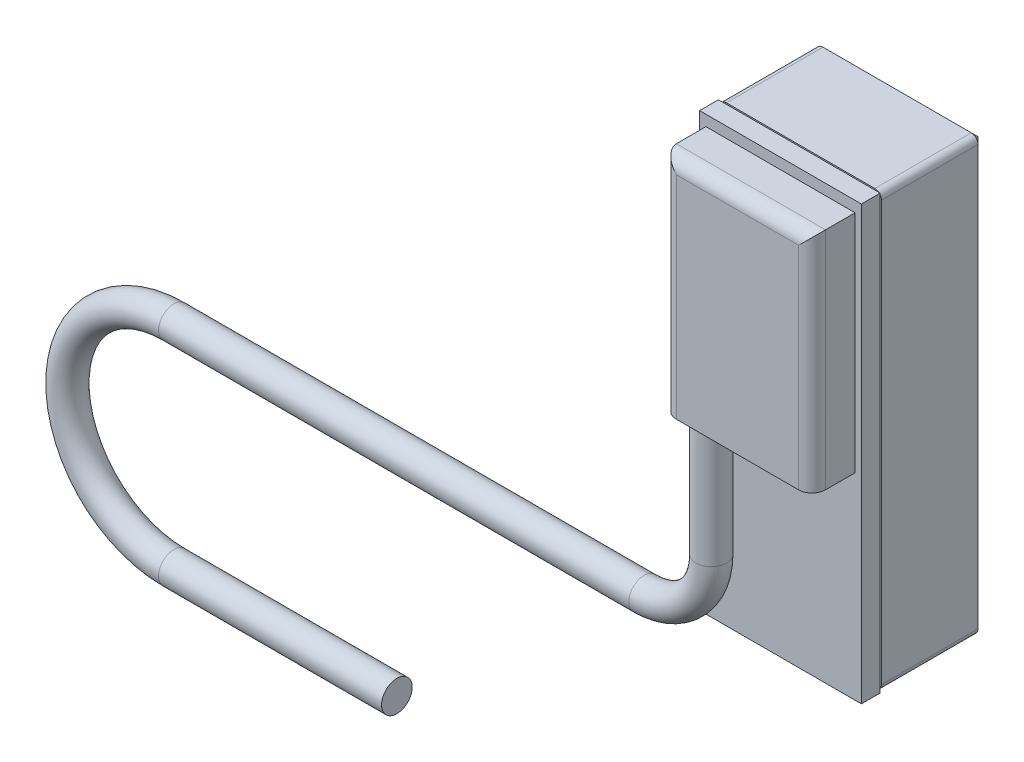
ISO-10303-21;
HEADER;
FILE_DESCRIPTION(('STEP AP214'),'2;1');
FILE_NAME('part.step','',(''),(''),'','','');
FILE_SCHEMA(('AUTOMOTIVE_DESIGN { 1 0 10303 214 1 1 1 1 }'));
ENDSEC;
DATA;
#1=APPLICATION_CONTEXT('core data for automotive mechanical design processes');
#2=APPLICATION_PROTOCOL_DEFINITION('international standard','automotive_design',2000,#1);
#3=PRODUCT_CONTEXT('',#1,'mechanical');
#4=PRODUCT('Part','Part','',(#3));
#5=PRODUCT_RELATED_PRODUCT_CATEGORY('part','',(#4));
#6=PRODUCT_DEFINITION_FORMATION('','',#4);
#7=PRODUCT_DEFINITION_CONTEXT('part definition',#1,'design');
#8=PRODUCT_DEFINITION('design','',#6,#7);
#9=PRODUCT_DEFINITION_SHAPE('','',#8);
#10=(LENGTH_UNIT() NAMED_UNIT(*) SI_UNIT(.MILLI.,.METRE.));
#11=(NAMED_UNIT(*) PLANE_ANGLE_UNIT() SI_UNIT($,.RADIAN.));
#12=(NAMED_UNIT(*) SI_UNIT($,.STERADIAN.) SOLID_ANGLE_UNIT());
#13=UNCERTAINTY_MEASURE_WITH_UNIT(LENGTH_MEASURE(1.E-05),#10,'distance_accuracy_value','');
#14=(GEOMETRIC_REPRESENTATION_CONTEXT(3) GLOBAL_UNCERTAINTY_ASSIGNED_CONTEXT((#13)) GLOBAL_UNIT_ASSIGNED_CONTEXT((#10,
#11,#12)) REPRESENTATION_CONTEXT('',''));
#15=CARTESIAN_POINT('',(0.,0.,0.));
#16=DIRECTION('',(0.,0.,1.));
#17=DIRECTION('',(1.,0.,0.));
#18=AXIS2_PLACEMENT_3D('',#15,#16,#17);
#19=CARTESIAN_POINT('',(0.,0.,4.59));
#20=DIRECTION('',(0.,0.,-1.));
#21=DIRECTION('',(-1.,0.,0.));
#22=AXIS2_PLACEMENT_3D('',#19,#20,#21);
#23=PLANE('',#22);
#24=DIRECTION('',(0.,1.,0.));
#25=VECTOR('',#24,1.);
#26=CARTESIAN_POINT('',(3.01,-8.055,4.59));
#27=LINE('',#26,#25);
#28=CARTESIAN_POINT('',(3.01,-8.055,4.59));
#29=VERTEX_POINT('',#28);
#30=CARTESIAN_POINT('',(3.01,8.055,4.59));
#31=VERTEX_POINT('',#30);
#32=EDGE_CURVE('E162',#29,#31,#27,.T.);
#33=ORIENTED_EDGE('',*,*,#32,.T.);
#34=DIRECTION('',(-1.,0.,0.));
#35=VECTOR('',#34,1.);
#36=CARTESIAN_POINT('',(-3.01,8.055,4.59));
#37=LINE('',#36,#35);
#38=CARTESIAN_POINT('',(-3.01,8.055,4.59));
#39=VERTEX_POINT('',#38);
#40=EDGE_CURVE('E165',#31,#39,#37,.T.);
#41=ORIENTED_EDGE('',*,*,#40,.T.);
#42=DIRECTION('',(0.,-1.,0.));
#43=VECTOR('',#42,1.);
#44=CARTESIAN_POINT('',(-3.01,-8.055,4.59));
#45=LINE('',#44,#43);
#46=CARTESIAN_POINT('',(-3.01,-8.055,4.59));
#47=VERTEX_POINT('',#46);
#48=EDGE_CURVE('E168',#39,#47,#45,.T.);
#49=ORIENTED_EDGE('',*,*,#48,.T.);
#50=DIRECTION('',(1.,0.,0.));
#51=VECTOR('',#50,1.);
#52=CARTESIAN_POINT('',(-3.01,-8.055,4.59));
#53=LINE('',#52,#51);
#54=EDGE_CURVE('E170',#47,#29,#53,.T.);
#55=ORIENTED_EDGE('',*,*,#54,.T.);
#56=EDGE_LOOP('',(#33,#41,#49,#55));
#57=FACE_BOUND('',#56,.T.);
#58=DIRECTION('',(0.,1.,0.));
#59=VECTOR('',#58,1.);
#60=CARTESIAN_POINT('',(2.775,-0.725000000000003,4.59));
#61=LINE('',#60,#59);
#62=CARTESIAN_POINT('',(2.775,-0.725000000000003,4.59));
#63=VERTEX_POINT('',#62);
#64=CARTESIAN_POINT('',(2.775,7.655,4.59));
#65=VERTEX_POINT('',#64);
#66=EDGE_CURVE('E143',#63,#65,#61,.T.);
#67=ORIENTED_EDGE('',*,*,#66,.F.);
#68=DIRECTION('',(1.,0.,0.));
#69=VECTOR('',#68,1.);
#70=CARTESIAN_POINT('',(-2.775,-0.725000000000003,4.59));
#71=LINE('',#70,#69);
#72=CARTESIAN_POINT('',(-2.775,-0.725000000000003,4.59));
#73=VERTEX_POINT('',#72);
#74=EDGE_CURVE('E142',#73,#63,#71,.T.);
#75=ORIENTED_EDGE('',*,*,#74,.F.);
#76=DIRECTION('',(0.,-1.,0.));
#77=VECTOR('',#76,1.);
#78=CARTESIAN_POINT('',(-2.775,-0.725000000000003,4.59));
#79=LINE('',#78,#77);
#80=CARTESIAN_POINT('',(-2.775,7.655,4.59));
#81=VERTEX_POINT('',#80);
#82=EDGE_CURVE('E149',#81,#73,#79,.T.);
#83=ORIENTED_EDGE('',*,*,#82,.F.);
#84=DIRECTION('',(-1.,0.,0.));
#85=VECTOR('',#84,1.);
#86=CARTESIAN_POINT('',(-2.775,7.655,4.59));
#87=LINE('',#86,#85);
#88=EDGE_CURVE('E146',#65,#81,#87,.T.);
#89=ORIENTED_EDGE('',*,*,#88,.F.);
#90=EDGE_LOOP('',(#67,#75,#83,#89));
#91=FACE_BOUND('',#90,.T.);
#92=ADVANCED_FACE('F46',(#57,#91),#23,.F.);
#93=CARTESIAN_POINT('',(3.01,-8.055,4.59));
#94=DIRECTION('',(-1.,0.,0.));
#95=DIRECTION('',(0.,0.,1.));
#96=AXIS2_PLACEMENT_3D('',#93,#94,#95);
#97=PLANE('',#96);
#98=DIRECTION('',(0.,1.,0.));
#99=VECTOR('',#98,1.);
#100=CARTESIAN_POINT('',(3.01,-8.055,3.89));
#101=LINE('',#100,#99);
#102=CARTESIAN_POINT('',(3.01,-8.055,3.89));
#103=VERTEX_POINT('',#102);
#104=CARTESIAN_POINT('',(3.01,8.055,3.89));
#105=VERTEX_POINT('',#104);
#106=EDGE_CURVE('E161',#103,#105,#101,.T.);
#107=ORIENTED_EDGE('',*,*,#106,.T.);
#108=DIRECTION('',(0.,0.,-1.));
#109=VECTOR('',#108,1.);
#110=CARTESIAN_POINT('',(3.01,8.055,4.59));
#111=LINE('',#110,#109);
#112=EDGE_CURVE('E188',#31,#105,#111,.T.);
#113=ORIENTED_EDGE('',*,*,#112,.F.);
#114=ORIENTED_EDGE('',*,*,#32,.F.);
#115=DIRECTION('',(0.,0.,-1.));
#116=VECTOR('',#115,1.);
#117=CARTESIAN_POINT('',(3.01,-8.055,4.59));
#118=LINE('',#117,#116);
#119=EDGE_CURVE('E172',#29,#103,#118,.T.);
#120=ORIENTED_EDGE('',*,*,#119,.T.);
#121=EDGE_LOOP('',(#107,#113,#114,#120));
#122=FACE_BOUND('',#121,.T.);
#123=ADVANCED_FACE('F239',(#122),#97,.F.);
#124=CARTESIAN_POINT('',(-3.01,8.055,4.59));
#125=DIRECTION('',(0.,-1.,0.));
#126=DIRECTION('',(0.,0.,-1.));
#127=AXIS2_PLACEMENT_3D('',#124,#125,#126);
#128=PLANE('',#127);
#129=DIRECTION('',(-1.,0.,0.));
#130=VECTOR('',#129,1.);
#131=CARTESIAN_POINT('',(-3.01,8.055,3.89));
#132=LINE('',#131,#130);
#133=CARTESIAN_POINT('',(-3.01,8.055,3.89));
#134=VERTEX_POINT('',#133);
#135=EDGE_CURVE('E175',#105,#134,#132,.T.);
#136=ORIENTED_EDGE('',*,*,#135,.T.);
#137=DIRECTION('',(0.,0.,-1.));
#138=VECTOR('',#137,1.);
#139=CARTESIAN_POINT('',(-3.01,8.055,4.59));
#140=LINE('',#139,#138);
#141=EDGE_CURVE('E185',#39,#134,#140,.T.);
#142=ORIENTED_EDGE('',*,*,#141,.F.);
#143=ORIENTED_EDGE('',*,*,#40,.F.);
#144=ORIENTED_EDGE('',*,*,#112,.T.);
#145=EDGE_LOOP('',(#136,#142,#143,#144));
#146=FACE_BOUND('',#145,.T.);
#147=ADVANCED_FACE('F245',(#146),#128,.F.);
#148=CARTESIAN_POINT('',(-3.01,-8.055,4.59));
#149=DIRECTION('',(1.,0.,0.));
#150=DIRECTION('',(0.,0.,-1.));
#151=AXIS2_PLACEMENT_3D('',#148,#149,#150);
#152=PLANE('',#151);
#153=DIRECTION('',(0.,-1.,0.));
#154=VECTOR('',#153,1.);
#155=CARTESIAN_POINT('',(-3.01,-8.055,3.89));
#156=LINE('',#155,#154);
#157=CARTESIAN_POINT('',(-3.01,-8.055,3.89));
#158=VERTEX_POINT('',#157);
#159=EDGE_CURVE('E177',#134,#158,#156,.T.);
#160=ORIENTED_EDGE('',*,*,#159,.T.);
#161=DIRECTION('',(0.,0.,-1.));
#162=VECTOR('',#161,1.);
#163=CARTESIAN_POINT('',(-3.01,-8.055,4.59));
#164=LINE('',#163,#162);
#165=EDGE_CURVE('E182',#47,#158,#164,.T.);
#166=ORIENTED_EDGE('',*,*,#165,.F.);
#167=ORIENTED_EDGE('',*,*,#48,.F.);
#168=ORIENTED_EDGE('',*,*,#141,.T.);
#169=EDGE_LOOP('',(#160,#166,#167,#168));
#170=FACE_BOUND('',#169,.T.);
#171=ADVANCED_FACE('F255',(#170),#152,.F.);
#172=CARTESIAN_POINT('',(-3.01,-8.055,4.59));
#173=DIRECTION('',(0.,1.,0.));
#174=DIRECTION('',(0.,0.,1.));
#175=AXIS2_PLACEMENT_3D('',#172,#173,#174);
#176=PLANE('',#175);
#177=DIRECTION('',(1.,0.,0.));
#178=VECTOR('',#177,1.);
#179=CARTESIAN_POINT('',(-3.01,-8.055,3.89));
#180=LINE('',#179,#178);
#181=EDGE_CURVE('E166',#158,#103,#180,.T.);
#182=ORIENTED_EDGE('',*,*,#181,.T.);
#183=ORIENTED_EDGE('',*,*,#119,.F.);
#184=ORIENTED_EDGE('',*,*,#54,.F.);
#185=ORIENTED_EDGE('',*,*,#165,.T.);
#186=EDGE_LOOP('',(#182,#183,#184,#185));
#187=FACE_BOUND('',#186,.T.);
#188=ADVANCED_FACE('F251',(#187),#176,.F.);
#189=CARTESIAN_POINT('',(0.,0.,3.89));
#190=DIRECTION('',(0.,0.,-1.));
#191=DIRECTION('',(-1.,0.,0.));
#192=AXIS2_PLACEMENT_3D('',#189,#190,#191);
#193=PLANE('',#192);
#194=ORIENTED_EDGE('',*,*,#106,.F.);
#195=ORIENTED_EDGE('',*,*,#181,.F.);
#196=ORIENTED_EDGE('',*,*,#159,.F.);
#197=ORIENTED_EDGE('',*,*,#135,.F.);
#198=EDGE_LOOP('',(#194,#195,#196,#197));
#199=FACE_BOUND('',#198,.T.);
#200=ADVANCED_FACE('F236',(#199),#193,.T.);
#201=CARTESIAN_POINT('',(2.775,-0.725000000000003,6.19));
#202=DIRECTION('',(-1.,0.,0.));
#203=DIRECTION('',(0.,0.,1.));
#204=AXIS2_PLACEMENT_3D('',#201,#202,#203);
#205=PLANE('',#204);
#206=DIRECTION('',(0.,0.,-1.));
#207=VECTOR('',#206,1.);
#208=CARTESIAN_POINT('',(2.775,7.655,6.19));
#209=LINE('',#208,#207);
#210=CARTESIAN_POINT('',(2.775,7.655,5.69));
#211=VERTEX_POINT('',#210);
#212=EDGE_CURVE('E159',#211,#65,#209,.T.);
#213=ORIENTED_EDGE('',*,*,#212,.F.);
#214=DIRECTION('',(0.,1.,0.));
#215=VECTOR('',#214,1.);
#216=CARTESIAN_POINT('',(2.775,-0.725000000000003,5.69));
#217=LINE('',#216,#215);
#218=CARTESIAN_POINT('',(2.775,-0.725000000000003,5.69));
#219=VERTEX_POINT('',#218);
#220=EDGE_CURVE('E12',#211,#219,#217,.F.);
#221=ORIENTED_EDGE('',*,*,#220,.T.);
#222=DIRECTION('',(0.,0.,-1.));
#223=VECTOR('',#222,1.);
#224=CARTESIAN_POINT('',(2.775,-0.725000000000003,6.19));
#225=LINE('',#224,#223);
#226=EDGE_CURVE('E141',#219,#63,#225,.T.);
#227=ORIENTED_EDGE('',*,*,#226,.T.);
#228=ORIENTED_EDGE('',*,*,#66,.T.);
#229=EDGE_LOOP('',(#213,#221,#227,#228));
#230=FACE_BOUND('',#229,.T.);
#231=ADVANCED_FACE('F224',(#230),#205,.F.);
#232=CARTESIAN_POINT('',(-2.775,7.655,6.19));
#233=DIRECTION('',(0.,-1.,0.));
#234=DIRECTION('',(0.,0.,-1.));
#235=AXIS2_PLACEMENT_3D('',#232,#233,#234);
#236=PLANE('',#235);
#237=DIRECTION('',(0.,0.,-1.));
#238=VECTOR('',#237,1.);
#239=CARTESIAN_POINT('',(-2.775,7.655,6.19));
#240=LINE('',#239,#238);
#241=CARTESIAN_POINT('',(-2.775,7.655,5.69));
#242=VERTEX_POINT('',#241);
#243=EDGE_CURVE('E157',#242,#81,#240,.T.);
#244=ORIENTED_EDGE('',*,*,#243,.F.);
#245=DIRECTION('',(-1.,0.,0.));
#246=VECTOR('',#245,1.);
#247=CARTESIAN_POINT('',(-2.775,7.655,5.69));
#248=LINE('',#247,#246);
#249=EDGE_CURVE('E55',#242,#211,#248,.F.);
#250=ORIENTED_EDGE('',*,*,#249,.T.);
#251=ORIENTED_EDGE('',*,*,#212,.T.);
#252=ORIENTED_EDGE('',*,*,#88,.T.);
#253=EDGE_LOOP('',(#244,#250,#251,#252));
#254=FACE_BOUND('',#253,.T.);
#255=ADVANCED_FACE('F228',(#254),#236,.F.);
#256=CARTESIAN_POINT('',(-2.775,-0.725000000000003,6.19));
#257=DIRECTION('',(1.,0.,0.));
#258=DIRECTION('',(0.,0.,-1.));
#259=AXIS2_PLACEMENT_3D('',#256,#257,#258);
#260=PLANE('',#259);
#261=DIRECTION('',(0.,0.,-1.));
#262=VECTOR('',#261,1.);
#263=CARTESIAN_POINT('',(-2.775,-0.725000000000003,6.19));
#264=LINE('',#263,#262);
#265=CARTESIAN_POINT('',(-2.775,-0.725000000000003,5.69));
#266=VERTEX_POINT('',#265);
#267=EDGE_CURVE('E155',#266,#73,#264,.T.);
#268=ORIENTED_EDGE('',*,*,#267,.F.);
#269=DIRECTION('',(0.,-1.,0.));
#270=VECTOR('',#269,1.);
#271=CARTESIAN_POINT('',(-2.775,-0.725000000000003,5.69));
#272=LINE('',#271,#270);
#273=EDGE_CURVE('E70',#266,#242,#272,.F.);
#274=ORIENTED_EDGE('',*,*,#273,.T.);
#275=ORIENTED_EDGE('',*,*,#243,.T.);
#276=ORIENTED_EDGE('',*,*,#82,.T.);
#277=EDGE_LOOP('',(#268,#274,#275,#276));
#278=FACE_BOUND('',#277,.T.);
#279=ADVANCED_FACE('F209',(#278),#260,.F.);
#280=CARTESIAN_POINT('',(-2.775,-0.725000000000003,6.19));
#281=DIRECTION('',(0.,1.,0.));
#282=DIRECTION('',(0.,0.,1.));
#283=AXIS2_PLACEMENT_3D('',#280,#281,#282);
#284=PLANE('',#283);
#285=CARTESIAN_POINT('',(-1.775,-0.725000000000003,5.39));
#286=DIRECTION('',(0.,-1.,0.));
#287=DIRECTION('',(0.,0.,-1.));
#288=AXIS2_PLACEMENT_3D('',#285,#286,#287);
#289=CIRCLE('',#288,0.57);
#290=CARTESIAN_POINT('',(-1.775,-0.725000000000003,4.82));
#291=VERTEX_POINT('',#290);
#292=EDGE_CURVE('E308',#291,#291,#289,.T.);
#293=ORIENTED_EDGE('',*,*,#292,.F.);
#294=EDGE_LOOP('',(#293));
#295=FACE_BOUND('',#294,.T.);
#296=DIRECTION('',(1.,0.,0.));
#297=VECTOR('',#296,1.);
#298=CARTESIAN_POINT('',(-2.775,-0.725000000000003,6.19));
#299=LINE('',#298,#297);
#300=CARTESIAN_POINT('',(-2.275,-0.725000000000003,6.19));
#301=VERTEX_POINT('',#300);
#302=CARTESIAN_POINT('',(2.275,-0.725000000000003,6.19));
#303=VERTEX_POINT('',#302);
#304=EDGE_CURVE('E138',#301,#303,#299,.T.);
#305=ORIENTED_EDGE('',*,*,#304,.F.);
#306=CARTESIAN_POINT('',(-2.275,-0.725000000000003,5.69));
#307=DIRECTION('',(0.,1.,0.));
#308=DIRECTION('',(0.,0.,1.));
#309=AXIS2_PLACEMENT_3D('',#306,#307,#308);
#310=CIRCLE('',#309,0.5);
#311=EDGE_CURVE('E200',#301,#266,#310,.F.);
#312=ORIENTED_EDGE('',*,*,#311,.T.);
#313=ORIENTED_EDGE('',*,*,#267,.T.);
#314=ORIENTED_EDGE('',*,*,#74,.T.);
#315=ORIENTED_EDGE('',*,*,#226,.F.);
#316=CARTESIAN_POINT('',(2.275,-0.725000000000003,5.69));
#317=DIRECTION('',(0.,1.,0.));
#318=DIRECTION('',(0.,0.,1.));
#319=AXIS2_PLACEMENT_3D('',#316,#317,#318);
#320=CIRCLE('',#319,0.5);
#321=EDGE_CURVE('E198',#219,#303,#320,.F.);
#322=ORIENTED_EDGE('',*,*,#321,.T.);
#323=EDGE_LOOP('',(#305,#312,#313,#314,#315,#322));
#324=FACE_BOUND('',#323,.T.);
#325=ADVANCED_FACE('F205',(#295,#324),#284,.F.);
#326=CARTESIAN_POINT('',(0.,0.,6.19));
#327=DIRECTION('',(0.,0.,-1.));
#328=DIRECTION('',(-1.,0.,0.));
#329=AXIS2_PLACEMENT_3D('',#326,#327,#328);
#330=PLANE('',#329);
#331=DIRECTION('',(-1.,0.,0.));
#332=VECTOR('',#331,1.);
#333=CARTESIAN_POINT('',(0.,7.155,6.19));
#334=LINE('',#333,#332);
#335=CARTESIAN_POINT('',(2.275,7.155,6.19));
#336=VERTEX_POINT('',#335);
#337=CARTESIAN_POINT('',(-2.275,7.155,6.19));
#338=VERTEX_POINT('',#337);
#339=EDGE_CURVE('E193',#336,#338,#334,.T.);
#340=ORIENTED_EDGE('',*,*,#339,.T.);
#341=DIRECTION('',(0.,-1.,0.));
#342=VECTOR('',#341,1.);
#343=CARTESIAN_POINT('',(-2.275,0.,6.19));
#344=LINE('',#343,#342);
#345=EDGE_CURVE('E195',#338,#301,#344,.T.);
#346=ORIENTED_EDGE('',*,*,#345,.T.);
#347=ORIENTED_EDGE('',*,*,#304,.T.);
#348=DIRECTION('',(0.,1.,0.));
#349=VECTOR('',#348,1.);
#350=CARTESIAN_POINT('',(2.275,0.,6.19));
#351=LINE('',#350,#349);
#352=EDGE_CURVE('E191',#303,#336,#351,.T.);
#353=ORIENTED_EDGE('',*,*,#352,.T.);
#354=EDGE_LOOP('',(#340,#346,#347,#353));
#355=FACE_BOUND('',#354,.T.);
#356=ADVANCED_FACE('F269',(#355),#330,.F.);
#357=CARTESIAN_POINT('',(2.275,0.,5.69));
#358=DIRECTION('',(0.,1.,0.));
#359=DIRECTION('',(0.,0.,1.));
#360=AXIS2_PLACEMENT_3D('',#357,#358,#359);
#361=CYLINDRICAL_SURFACE('',#360,0.5);
#362=ORIENTED_EDGE('',*,*,#321,.F.);
#363=ORIENTED_EDGE('',*,*,#220,.F.);
#364=CARTESIAN_POINT('',(2.275,7.155,5.69));
#365=DIRECTION('',(-0.707106781186547,0.707106781186547,0.));
#366=DIRECTION('',(0.707106781186547,0.707106781186547,0.));
#367=AXIS2_PLACEMENT_3D('',#364,#365,#366);
#368=ELLIPSE('',#367,0.707106781186547,0.5);
#369=EDGE_CURVE('E50',#336,#211,#368,.T.);
#370=ORIENTED_EDGE('',*,*,#369,.F.);
#371=ORIENTED_EDGE('',*,*,#352,.F.);
#372=EDGE_LOOP('',(#362,#363,#370,#371));
#373=FACE_BOUND('',#372,.T.);
#374=ADVANCED_FACE('F48',(#373),#361,.T.);
#375=CARTESIAN_POINT('',(0.,7.155,5.69));
#376=DIRECTION('',(-1.,0.,0.));
#377=DIRECTION('',(0.,0.,1.));
#378=AXIS2_PLACEMENT_3D('',#375,#376,#377);
#379=CYLINDRICAL_SURFACE('',#378,0.5);
#380=ORIENTED_EDGE('',*,*,#369,.T.);
#381=ORIENTED_EDGE('',*,*,#249,.F.);
#382=CARTESIAN_POINT('',(-2.275,7.155,5.69));
#383=DIRECTION('',(-0.707106781186547,-0.707106781186547,0.));
#384=DIRECTION('',(-0.707106781186547,0.707106781186547,0.));
#385=AXIS2_PLACEMENT_3D('',#382,#383,#384);
#386=ELLIPSE('',#385,0.707106781186547,0.5);
#387=EDGE_CURVE('E129',#338,#242,#386,.T.);
#388=ORIENTED_EDGE('',*,*,#387,.F.);
#389=ORIENTED_EDGE('',*,*,#339,.F.);
#390=EDGE_LOOP('',(#380,#381,#388,#389));
#391=FACE_BOUND('',#390,.T.);
#392=ADVANCED_FACE('F216',(#391),#379,.T.);
#393=CARTESIAN_POINT('',(-2.275,0.,5.69));
#394=DIRECTION('',(0.,-1.,0.));
#395=DIRECTION('',(0.,0.,-1.));
#396=AXIS2_PLACEMENT_3D('',#393,#394,#395);
#397=CYLINDRICAL_SURFACE('',#396,0.5);
#398=ORIENTED_EDGE('',*,*,#387,.T.);
#399=ORIENTED_EDGE('',*,*,#273,.F.);
#400=ORIENTED_EDGE('',*,*,#311,.F.);
#401=ORIENTED_EDGE('',*,*,#345,.F.);
#402=EDGE_LOOP('',(#398,#399,#400,#401));
#403=FACE_BOUND('',#402,.T.);
#404=ADVANCED_FACE('F211',(#403),#397,.T.);
#405=CARTESIAN_POINT('',(-13.475,-15.645,5.39));
#406=DIRECTION('',(1.,0.,0.));
#407=DIRECTION('',(0.,0.,-1.));
#408=AXIS2_PLACEMENT_3D('',#405,#406,#407);
#409=PLANE('',#408);
#410=CARTESIAN_POINT('',(-13.475,-15.645,5.39));
#411=DIRECTION('',(1.,0.,0.));
#412=DIRECTION('',(0.,0.,-1.));
#413=AXIS2_PLACEMENT_3D('',#410,#411,#412);
#414=CIRCLE('',#413,0.57);
#415=CARTESIAN_POINT('',(-13.475,-15.645,4.82));
#416=VERTEX_POINT('',#415);
#417=EDGE_CURVE('E126',#416,#416,#414,.T.);
#418=ORIENTED_EDGE('',*,*,#417,.T.);
#419=EDGE_LOOP('',(#418));
#420=FACE_BOUND('',#419,.T.);
#421=ADVANCED_FACE('F127',(#420),#409,.T.);
#422=CARTESIAN_POINT('',(-1.775,-0.725000000000003,5.39));
#423=DIRECTION('',(0.,-1.,0.));
#424=DIRECTION('',(1.,0.,0.));
#425=AXIS2_PLACEMENT_3D('',#422,#423,#424);
#426=CYLINDRICAL_SURFACE('',#425,0.57);
#427=CARTESIAN_POINT('',(-1.775,-5.22499999999998,5.39));
#428=DIRECTION('',(0.,-1.,0.));
#429=DIRECTION('',(0.,0.,-1.));
#430=AXIS2_PLACEMENT_3D('',#427,#428,#429);
#431=CIRCLE('',#430,0.57);
#432=CARTESIAN_POINT('',(-1.20500000000001,-5.22499999999998,5.39));
#433=VERTEX_POINT('',#432);
#434=EDGE_CURVE('E305',#433,#433,#431,.T.);
#435=ORIENTED_EDGE('',*,*,#434,.F.);
#436=EDGE_LOOP('',(#435));
#437=FACE_BOUND('',#436,.T.);
#438=ORIENTED_EDGE('',*,*,#292,.T.);
#439=EDGE_LOOP('',(#438));
#440=FACE_BOUND('',#439,.T.);
#441=ADVANCED_FACE('F283',(#437,#440),#426,.T.);
#442=CARTESIAN_POINT('',(-4.275,-5.225,5.39));
#443=DIRECTION('',(0.,0.,-1.));
#444=DIRECTION('',(-1.,0.,0.));
#445=AXIS2_PLACEMENT_3D('',#442,#443,#444);
#446=TOROIDAL_SURFACE('',#445,2.5,0.57);
#447=CARTESIAN_POINT('',(-4.27500000000002,-7.725,5.39));
#448=DIRECTION('',(-1.,0.,0.));
#449=DIRECTION('',(0.,0.,-1.));
#450=AXIS2_PLACEMENT_3D('',#447,#448,#449);
#451=CIRCLE('',#450,0.57);
#452=CARTESIAN_POINT('',(-4.27500000000002,-8.295,5.39));
#453=VERTEX_POINT('',#452);
#454=EDGE_CURVE('E310',#453,#453,#451,.T.);
#455=CARTESIAN_POINT('',(-4.275,-5.225,5.39));
#456=DIRECTION('',(0.,0.,-1.));
#457=DIRECTION('',(-1.,0.,0.));
#458=AXIS2_PLACEMENT_3D('',#455,#456,#457);
#459=CIRCLE('',#458,3.06999999999999);
#460=EDGE_CURVE('',#433,#453,#459,.T.);
#461=ORIENTED_EDGE('',*,*,#434,.T.);
#462=ORIENTED_EDGE('',*,*,#454,.F.);
#463=ORIENTED_EDGE('',*,*,#460,.T.);
#464=ORIENTED_EDGE('',*,*,#460,.F.);
#465=EDGE_LOOP('',(#461,#463,#462,#464));
#466=FACE_BOUND('',#465,.T.);
#467=ADVANCED_FACE('F293',(#466),#446,.T.);
#468=CARTESIAN_POINT('',(-4.27500000000002,-7.725,5.39));
#469=DIRECTION('',(-1.,0.,0.));
#470=DIRECTION('',(0.,-1.,0.));
#471=AXIS2_PLACEMENT_3D('',#468,#469,#470);
#472=CYLINDRICAL_SURFACE('',#471,0.57);
#473=CARTESIAN_POINT('',(-21.775,-7.72500000000001,5.39));
#474=DIRECTION('',(-1.,0.,0.));
#475=DIRECTION('',(0.,0.,-1.));
#476=AXIS2_PLACEMENT_3D('',#473,#474,#475);
#477=CIRCLE('',#476,0.57);
#478=CARTESIAN_POINT('',(-21.775,-7.15500000000001,5.39));
#479=VERTEX_POINT('',#478);
#480=EDGE_CURVE('E134',#479,#479,#477,.T.);
#481=ORIENTED_EDGE('',*,*,#480,.F.);
#482=EDGE_LOOP('',(#481));
#483=FACE_BOUND('',#482,.T.);
#484=ORIENTED_EDGE('',*,*,#454,.T.);
#485=EDGE_LOOP('',(#484));
#486=FACE_BOUND('',#485,.T.);
#487=ADVANCED_FACE('F289',(#483,#486),#472,.T.);
#488=CARTESIAN_POINT('',(-21.775,-11.685,5.39));
#489=DIRECTION('',(0.,0.,1.));
#490=DIRECTION('',(1.,0.,0.));
#491=AXIS2_PLACEMENT_3D('',#488,#489,#490);
#492=TOROIDAL_SURFACE('',#491,3.96,0.57);
#493=CARTESIAN_POINT('',(-21.775,-15.645,5.39));
#494=DIRECTION('',(1.,0.,0.));
#495=DIRECTION('',(0.,0.,-1.));
#496=AXIS2_PLACEMENT_3D('',#493,#494,#495);
#497=CIRCLE('',#496,0.57);
#498=CARTESIAN_POINT('',(-21.775,-16.215,5.39));
#499=VERTEX_POINT('',#498);
#500=EDGE_CURVE('E130',#499,#499,#497,.T.);
#501=CARTESIAN_POINT('',(-21.775,-11.685,5.39));
#502=DIRECTION('',(0.,0.,1.));
#503=DIRECTION('',(1.,0.,0.));
#504=AXIS2_PLACEMENT_3D('',#501,#502,#503);
#505=CIRCLE('',#504,4.53);
#506=EDGE_CURVE('',#479,#499,#505,.T.);
#507=ORIENTED_EDGE('',*,*,#480,.T.);
#508=ORIENTED_EDGE('',*,*,#500,.F.);
#509=ORIENTED_EDGE('',*,*,#506,.T.);
#510=ORIENTED_EDGE('',*,*,#506,.F.);
#511=EDGE_LOOP('',(#507,#509,#508,#510));
#512=FACE_BOUND('',#511,.T.);
#513=ADVANCED_FACE('F286',(#512),#492,.T.);
#514=CARTESIAN_POINT('',(-21.775,-15.645,5.39));
#515=DIRECTION('',(1.,0.,0.));
#516=DIRECTION('',(0.,0.,-1.));
#517=AXIS2_PLACEMENT_3D('',#514,#515,#516);
#518=CYLINDRICAL_SURFACE('',#517,0.57);
#519=ORIENTED_EDGE('',*,*,#417,.F.);
#520=EDGE_LOOP('',(#519));
#521=FACE_BOUND('',#520,.T.);
#522=ORIENTED_EDGE('',*,*,#500,.T.);
#523=EDGE_LOOP('',(#522));
#524=FACE_BOUND('',#523,.T.);
#525=ADVANCED_FACE('F264',(#521,#524),#518,.T.);
#526=CLOSED_SHELL('',(#92,#123,#147,#171,#188,#200,#231,#255,#279,#325,#356,#374,#392,#404,#421,
#441,#467,#487,#513,#525));
#527=MANIFOLD_SOLID_BREP('B2',#526);
#528=CARTESIAN_POINT('',(3.01,-8.055,3.84));
#529=DIRECTION('',(-1.,0.,0.));
#530=DIRECTION('',(0.,0.,1.));
#531=AXIS2_PLACEMENT_3D('',#528,#529,#530);
#532=PLANE('',#531);
#533=DIRECTION('',(0.,0.,-1.));
#534=VECTOR('',#533,1.);
#535=CARTESIAN_POINT('',(3.01,-7.805,3.84));
#536=LINE('',#535,#534);
#537=CARTESIAN_POINT('',(3.01,-7.805,3.84));
#538=VERTEX_POINT('',#537);
#539=CARTESIAN_POINT('',(3.01,-7.805,0.25));
#540=VERTEX_POINT('',#539);
#541=EDGE_CURVE('E579',#538,#540,#536,.T.);
#542=ORIENTED_EDGE('',*,*,#541,.T.);
#543=DIRECTION('',(0.,1.,0.));
#544=VECTOR('',#543,1.);
#545=CARTESIAN_POINT('',(3.01,7.805,0.25));
#546=LINE('',#545,#544);
#547=CARTESIAN_POINT('',(3.01,7.805,0.25));
#548=VERTEX_POINT('',#547);
#549=EDGE_CURVE('E587',#540,#548,#546,.T.);
#550=ORIENTED_EDGE('',*,*,#549,.T.);
#551=DIRECTION('',(0.,0.,-1.));
#552=VECTOR('',#551,1.);
#553=CARTESIAN_POINT('',(3.01,7.805,3.84));
#554=LINE('',#553,#552);
#555=CARTESIAN_POINT('',(3.01,7.805,3.84));
#556=VERTEX_POINT('',#555);
#557=EDGE_CURVE('E553',#548,#556,#554,.F.);
#558=ORIENTED_EDGE('',*,*,#557,.T.);
#559=DIRECTION('',(0.,1.,0.));
#560=VECTOR('',#559,1.);
#561=CARTESIAN_POINT('',(3.01,-8.055,3.84));
#562=LINE('',#561,#560);
#563=EDGE_CURVE('E639',#538,#556,#562,.T.);
#564=ORIENTED_EDGE('',*,*,#563,.F.);
#565=EDGE_LOOP('',(#542,#550,#558,#564));
#566=FACE_BOUND('',#565,.T.);
#567=ADVANCED_FACE('F464',(#566),#532,.F.);
#568=CARTESIAN_POINT('',(-3.01,8.055,3.84));
#569=DIRECTION('',(0.,-1.,0.));
#570=DIRECTION('',(0.,0.,-1.));
#571=AXIS2_PLACEMENT_3D('',#568,#569,#570);
#572=PLANE('',#571);
#573=DIRECTION('',(0.,0.,-1.));
#574=VECTOR('',#573,1.);
#575=CARTESIAN_POINT('',(2.76,8.055,3.84));
#576=LINE('',#575,#574);
#577=CARTESIAN_POINT('',(2.76,8.055,3.84));
#578=VERTEX_POINT('',#577);
#579=CARTESIAN_POINT('',(2.76,8.055,0.25));
#580=VERTEX_POINT('',#579);
#581=EDGE_CURVE('E584',#578,#580,#576,.T.);
#582=ORIENTED_EDGE('',*,*,#581,.T.);
#583=DIRECTION('',(-1.,0.,0.));
#584=VECTOR('',#583,1.);
#585=CARTESIAN_POINT('',(-2.76,8.055,0.25));
#586=LINE('',#585,#584);
#587=CARTESIAN_POINT('',(-2.76,8.055,0.25));
#588=VERTEX_POINT('',#587);
#589=EDGE_CURVE('E603',#580,#588,#586,.T.);
#590=ORIENTED_EDGE('',*,*,#589,.T.);
#591=DIRECTION('',(0.,0.,-1.));
#592=VECTOR('',#591,1.);
#593=CARTESIAN_POINT('',(-2.76,8.055,3.84));
#594=LINE('',#593,#592);
#595=CARTESIAN_POINT('',(-2.76,8.055,3.84));
#596=VERTEX_POINT('',#595);
#597=EDGE_CURVE('E582',#588,#596,#594,.F.);
#598=ORIENTED_EDGE('',*,*,#597,.T.);
#599=DIRECTION('',(-1.,0.,0.));
#600=VECTOR('',#599,1.);
#601=CARTESIAN_POINT('',(-3.01,8.055,3.84));
#602=LINE('',#601,#600);
#603=EDGE_CURVE('E644',#578,#596,#602,.T.);
#604=ORIENTED_EDGE('',*,*,#603,.F.);
#605=EDGE_LOOP('',(#582,#590,#598,#604));
#606=FACE_BOUND('',#605,.T.);
#607=ADVANCED_FACE('F675',(#606),#572,.F.);
#608=CARTESIAN_POINT('',(-3.01,-8.055,3.84));
#609=DIRECTION('',(1.,0.,0.));
#610=DIRECTION('',(0.,0.,-1.));
#611=AXIS2_PLACEMENT_3D('',#608,#609,#610);
#612=PLANE('',#611);
#613=DIRECTION('',(0.,0.,-1.));
#614=VECTOR('',#613,1.);
#615=CARTESIAN_POINT('',(-3.01,7.805,3.84));
#616=LINE('',#615,#614);
#617=CARTESIAN_POINT('',(-3.01,7.805,3.84));
#618=VERTEX_POINT('',#617);
#619=CARTESIAN_POINT('',(-3.01,7.805,0.25));
#620=VERTEX_POINT('',#619);
#621=EDGE_CURVE('E566',#618,#620,#616,.T.);
#622=ORIENTED_EDGE('',*,*,#621,.T.);
#623=DIRECTION('',(0.,-1.,0.));
#624=VECTOR('',#623,1.);
#625=CARTESIAN_POINT('',(-3.01,-7.805,0.25));
#626=LINE('',#625,#624);
#627=CARTESIAN_POINT('',(-3.01,-7.805,0.25));
#628=VERTEX_POINT('',#627);
#629=EDGE_CURVE('E44',#620,#628,#626,.T.);
#630=ORIENTED_EDGE('',*,*,#629,.T.);
#631=DIRECTION('',(0.,0.,-1.));
#632=VECTOR('',#631,1.);
#633=CARTESIAN_POINT('',(-3.01,-7.805,3.84));
#634=LINE('',#633,#632);
#635=CARTESIAN_POINT('',(-3.01,-7.805,3.84));
#636=VERTEX_POINT('',#635);
#637=EDGE_CURVE('E568',#628,#636,#634,.F.);
#638=ORIENTED_EDGE('',*,*,#637,.T.);
#639=DIRECTION('',(0.,-1.,0.));
#640=VECTOR('',#639,1.);
#641=CARTESIAN_POINT('',(-3.01,-8.055,3.84));
#642=LINE('',#641,#640);
#643=EDGE_CURVE('E550',#618,#636,#642,.T.);
#644=ORIENTED_EDGE('',*,*,#643,.F.);
#645=EDGE_LOOP('',(#622,#630,#638,#644));
#646=FACE_BOUND('',#645,.T.);
#647=ADVANCED_FACE('F653',(#646),#612,.F.);
#648=CARTESIAN_POINT('',(-3.01,-8.055,3.84));
#649=DIRECTION('',(0.,1.,0.));
#650=DIRECTION('',(0.,0.,1.));
#651=AXIS2_PLACEMENT_3D('',#648,#649,#650);
#652=PLANE('',#651);
#653=DIRECTION('',(0.,0.,-1.));
#654=VECTOR('',#653,1.);
#655=CARTESIAN_POINT('',(-2.76,-8.055,3.84));
#656=LINE('',#655,#654);
#657=CARTESIAN_POINT('',(-2.76,-8.055,3.84));
#658=VERTEX_POINT('',#657);
#659=CARTESIAN_POINT('',(-2.76,-8.055,0.25));
#660=VERTEX_POINT('',#659);
#661=EDGE_CURVE('E559',#658,#660,#656,.T.);
#662=ORIENTED_EDGE('',*,*,#661,.T.);
#663=DIRECTION('',(1.,0.,0.));
#664=VECTOR('',#663,1.);
#665=CARTESIAN_POINT('',(2.76,-8.055,0.25));
#666=LINE('',#665,#664);
#667=CARTESIAN_POINT('',(2.76,-8.055,0.25));
#668=VERTEX_POINT('',#667);
#669=EDGE_CURVE('E605',#660,#668,#666,.T.);
#670=ORIENTED_EDGE('',*,*,#669,.T.);
#671=DIRECTION('',(0.,0.,-1.));
#672=VECTOR('',#671,1.);
#673=CARTESIAN_POINT('',(2.76,-8.055,3.84));
#674=LINE('',#673,#672);
#675=CARTESIAN_POINT('',(2.76,-8.055,3.84));
#676=VERTEX_POINT('',#675);
#677=EDGE_CURVE('E562',#668,#676,#674,.F.);
#678=ORIENTED_EDGE('',*,*,#677,.T.);
#679=DIRECTION('',(1.,0.,0.));
#680=VECTOR('',#679,1.);
#681=CARTESIAN_POINT('',(-3.01,-8.055,3.84));
#682=LINE('',#681,#680);
#683=EDGE_CURVE('E547',#658,#676,#682,.T.);
#684=ORIENTED_EDGE('',*,*,#683,.F.);
#685=EDGE_LOOP('',(#662,#670,#678,#684));
#686=FACE_BOUND('',#685,.T.);
#687=ADVANCED_FACE('F558',(#686),#652,.F.);
#688=CARTESIAN_POINT('',(0.,0.,3.84));
#689=DIRECTION('',(0.,0.,-1.));
#690=DIRECTION('',(-1.,0.,0.));
#691=AXIS2_PLACEMENT_3D('',#688,#689,#690);
#692=PLANE('',#691);
#693=ORIENTED_EDGE('',*,*,#643,.T.);
#694=CARTESIAN_POINT('',(-2.76,-7.805,3.84));
#695=DIRECTION('',(0.,0.,-1.));
#696=DIRECTION('',(-1.,0.,0.));
#697=AXIS2_PLACEMENT_3D('',#694,#695,#696);
#698=CIRCLE('',#697,0.25);
#699=EDGE_CURVE('E544',#636,#658,#698,.F.);
#700=ORIENTED_EDGE('',*,*,#699,.T.);
#701=ORIENTED_EDGE('',*,*,#683,.T.);
#702=CARTESIAN_POINT('',(2.76,-7.805,3.84));
#703=DIRECTION('',(0.,0.,-1.));
#704=DIRECTION('',(-1.,0.,0.));
#705=AXIS2_PLACEMENT_3D('',#702,#703,#704);
#706=CIRCLE('',#705,0.25);
#707=EDGE_CURVE('E554',#676,#538,#706,.F.);
#708=ORIENTED_EDGE('',*,*,#707,.T.);
#709=ORIENTED_EDGE('',*,*,#563,.T.);
#710=CARTESIAN_POINT('',(2.76,7.805,3.84));
#711=DIRECTION('',(0.,0.,-1.));
#712=DIRECTION('',(-1.,0.,0.));
#713=AXIS2_PLACEMENT_3D('',#710,#711,#712);
#714=CIRCLE('',#713,0.25);
#715=EDGE_CURVE('E575',#556,#578,#714,.F.);
#716=ORIENTED_EDGE('',*,*,#715,.T.);
#717=ORIENTED_EDGE('',*,*,#603,.T.);
#718=CARTESIAN_POINT('',(-2.76,7.805,3.84));
#719=DIRECTION('',(0.,0.,-1.));
#720=DIRECTION('',(-1.,0.,0.));
#721=AXIS2_PLACEMENT_3D('',#718,#719,#720);
#722=CIRCLE('',#721,0.25);
#723=EDGE_CURVE('E573',#596,#618,#722,.F.);
#724=ORIENTED_EDGE('',*,*,#723,.T.);
#725=EDGE_LOOP('',(#693,#700,#701,#708,#709,#716,#717,#724));
#726=FACE_BOUND('',#725,.T.);
#727=ADVANCED_FACE('F546',(#726),#692,.F.);
#728=CARTESIAN_POINT('',(0.,0.,0.));
#729=DIRECTION('',(0.,0.,-1.));
#730=DIRECTION('',(-1.,0.,0.));
#731=AXIS2_PLACEMENT_3D('',#728,#729,#730);
#732=PLANE('',#731);
#733=DIRECTION('',(1.,0.,0.));
#734=VECTOR('',#733,1.);
#735=CARTESIAN_POINT('',(2.76,7.805,0.));
#736=LINE('',#735,#734);
#737=CARTESIAN_POINT('',(-2.76,7.805,0.));
#738=VERTEX_POINT('',#737);
#739=CARTESIAN_POINT('',(2.76,7.805,0.));
#740=VERTEX_POINT('',#739);
#741=EDGE_CURVE('E594',#738,#740,#736,.T.);
#742=ORIENTED_EDGE('',*,*,#741,.T.);
#743=DIRECTION('',(0.,-1.,0.));
#744=VECTOR('',#743,1.);
#745=CARTESIAN_POINT('',(2.76,-7.805,0.));
#746=LINE('',#745,#744);
#747=CARTESIAN_POINT('',(2.76,-7.805,0.));
#748=VERTEX_POINT('',#747);
#749=EDGE_CURVE('E596',#740,#748,#746,.T.);
#750=ORIENTED_EDGE('',*,*,#749,.T.);
#751=DIRECTION('',(-1.,0.,0.));
#752=VECTOR('',#751,1.);
#753=CARTESIAN_POINT('',(-2.76,-7.805,0.));
#754=LINE('',#753,#752);
#755=CARTESIAN_POINT('',(-2.76,-7.805,0.));
#756=VERTEX_POINT('',#755);
#757=EDGE_CURVE('E592',#748,#756,#754,.T.);
#758=ORIENTED_EDGE('',*,*,#757,.T.);
#759=DIRECTION('',(0.,1.,0.));
#760=VECTOR('',#759,1.);
#761=CARTESIAN_POINT('',(-2.76,7.805,0.));
#762=LINE('',#761,#760);
#763=EDGE_CURVE('E590',#756,#738,#762,.T.);
#764=ORIENTED_EDGE('',*,*,#763,.T.);
#765=EDGE_LOOP('',(#742,#750,#758,#764));
#766=FACE_BOUND('',#765,.T.);
#767=CARTESIAN_POINT('',(0.87,0.794999999999999,0.));
#768=DIRECTION('',(0.,0.,-1.));
#769=DIRECTION('',(-1.,0.,0.));
#770=AXIS2_PLACEMENT_3D('',#767,#768,#769);
#771=CIRCLE('',#770,0.725);
#772=CARTESIAN_POINT('',(0.145,0.794999999999999,0.));
#773=VERTEX_POINT('',#772);
#774=EDGE_CURVE('E630',#773,#773,#771,.T.);
#775=ORIENTED_EDGE('',*,*,#774,.F.);
#776=EDGE_LOOP('',(#775));
#777=FACE_BOUND('',#776,.T.);
#778=ADVANCED_FACE('F687',(#766,#777),#732,.T.);
#779=CARTESIAN_POINT('',(0.87,0.794999999999999,-0.2));
#780=DIRECTION('',(0.,0.,1.));
#781=DIRECTION('',(1.,0.,0.));
#782=AXIS2_PLACEMENT_3D('',#779,#780,#781);
#783=CYLINDRICAL_SURFACE('',#782,0.725);
#784=CARTESIAN_POINT('',(0.87,0.794999999999999,-0.2));
#785=DIRECTION('',(0.,0.,-1.));
#786=DIRECTION('',(-1.,0.,0.));
#787=AXIS2_PLACEMENT_3D('',#784,#785,#786);
#788=CIRCLE('',#787,0.725);
#789=CARTESIAN_POINT('',(0.145,0.794999999999999,-0.2));
#790=VERTEX_POINT('',#789);
#791=EDGE_CURVE('E634',#790,#790,#788,.T.);
#792=ORIENTED_EDGE('',*,*,#791,.F.);
#793=EDGE_LOOP('',(#792));
#794=FACE_BOUND('',#793,.T.);
#795=ORIENTED_EDGE('',*,*,#774,.T.);
#796=EDGE_LOOP('',(#795));
#797=FACE_BOUND('',#796,.T.);
#798=ADVANCED_FACE('F690',(#794,#797),#783,.T.);
#799=CARTESIAN_POINT('',(0.87,0.794999999999999,-0.2));
#800=DIRECTION('',(0.,0.,-1.));
#801=DIRECTION('',(-1.,0.,0.));
#802=AXIS2_PLACEMENT_3D('',#799,#800,#801);
#803=PLANE('',#802);
#804=ORIENTED_EDGE('',*,*,#791,.T.);
#805=EDGE_LOOP('',(#804));
#806=FACE_BOUND('',#805,.T.);
#807=ADVANCED_FACE('F696',(#806),#803,.T.);
#808=CARTESIAN_POINT('',(-2.76,-7.805,3.84));
#809=DIRECTION('',(0.,0.,-1.));
#810=DIRECTION('',(-1.,0.,0.));
#811=AXIS2_PLACEMENT_3D('',#808,#809,#810);
#812=CYLINDRICAL_SURFACE('',#811,0.25);
#813=ORIENTED_EDGE('',*,*,#637,.F.);
#814=CARTESIAN_POINT('',(-2.76,-7.805,0.25));
#815=DIRECTION('',(0.,0.,-1.));
#816=DIRECTION('',(-1.,0.,0.));
#817=AXIS2_PLACEMENT_3D('',#814,#815,#816);
#818=CIRCLE('',#817,0.25);
#819=EDGE_CURVE('E473',#628,#660,#818,.F.);
#820=ORIENTED_EDGE('',*,*,#819,.T.);
#821=ORIENTED_EDGE('',*,*,#661,.F.);
#822=ORIENTED_EDGE('',*,*,#699,.F.);
#823=EDGE_LOOP('',(#813,#820,#821,#822));
#824=FACE_BOUND('',#823,.T.);
#825=ADVANCED_FACE('F564',(#824),#812,.T.);
#826=CARTESIAN_POINT('',(2.76,-7.805,3.84));
#827=DIRECTION('',(0.,0.,-1.));
#828=DIRECTION('',(-1.,0.,0.));
#829=AXIS2_PLACEMENT_3D('',#826,#827,#828);
#830=CYLINDRICAL_SURFACE('',#829,0.25);
#831=ORIENTED_EDGE('',*,*,#677,.F.);
#832=CARTESIAN_POINT('',(2.76,-7.805,0.25));
#833=DIRECTION('',(0.,0.,-1.));
#834=DIRECTION('',(-1.,0.,0.));
#835=AXIS2_PLACEMENT_3D('',#832,#833,#834);
#836=CIRCLE('',#835,0.25);
#837=EDGE_CURVE('E601',#668,#540,#836,.F.);
#838=ORIENTED_EDGE('',*,*,#837,.T.);
#839=ORIENTED_EDGE('',*,*,#541,.F.);
#840=ORIENTED_EDGE('',*,*,#707,.F.);
#841=EDGE_LOOP('',(#831,#838,#839,#840));
#842=FACE_BOUND('',#841,.T.);
#843=ADVANCED_FACE('F664',(#842),#830,.T.);
#844=CARTESIAN_POINT('',(2.76,7.805,3.84));
#845=DIRECTION('',(0.,0.,-1.));
#846=DIRECTION('',(-1.,0.,0.));
#847=AXIS2_PLACEMENT_3D('',#844,#845,#846);
#848=CYLINDRICAL_SURFACE('',#847,0.25);
#849=ORIENTED_EDGE('',*,*,#557,.F.);
#850=CARTESIAN_POINT('',(2.76,7.805,0.25));
#851=DIRECTION('',(0.,0.,-1.));
#852=DIRECTION('',(-1.,0.,0.));
#853=AXIS2_PLACEMENT_3D('',#850,#851,#852);
#854=CIRCLE('',#853,0.25);
#855=EDGE_CURVE('E599',#548,#580,#854,.F.);
#856=ORIENTED_EDGE('',*,*,#855,.T.);
#857=ORIENTED_EDGE('',*,*,#581,.F.);
#858=ORIENTED_EDGE('',*,*,#715,.F.);
#859=EDGE_LOOP('',(#849,#856,#857,#858));
#860=FACE_BOUND('',#859,.T.);
#861=ADVANCED_FACE('F672',(#860),#848,.T.);
#862=CARTESIAN_POINT('',(-2.76,7.805,3.84));
#863=DIRECTION('',(0.,0.,-1.));
#864=DIRECTION('',(-1.,0.,0.));
#865=AXIS2_PLACEMENT_3D('',#862,#863,#864);
#866=CYLINDRICAL_SURFACE('',#865,0.25);
#867=ORIENTED_EDGE('',*,*,#597,.F.);
#868=CARTESIAN_POINT('',(-2.76,7.805,0.25));
#869=DIRECTION('',(0.,0.,-1.));
#870=DIRECTION('',(-1.,0.,0.));
#871=AXIS2_PLACEMENT_3D('',#868,#869,#870);
#872=CIRCLE('',#871,0.25);
#873=EDGE_CURVE('E487',#588,#620,#872,.F.);
#874=ORIENTED_EDGE('',*,*,#873,.T.);
#875=ORIENTED_EDGE('',*,*,#621,.F.);
#876=ORIENTED_EDGE('',*,*,#723,.F.);
#877=EDGE_LOOP('',(#867,#874,#875,#876));
#878=FACE_BOUND('',#877,.T.);
#879=ADVANCED_FACE('F652',(#878),#866,.T.);
#880=CARTESIAN_POINT('',(-3.01,-8.055,0.25));
#881=DIRECTION('',(-0.707106781186545,0.,-0.70710678118655));
#882=DIRECTION('',(0.,1.,0.));
#883=AXIS2_PLACEMENT_3D('',#880,#881,#882);
#884=PLANE('',#883);
#885=DIRECTION('',(0.70710678118655,0.,-0.707106781186545));
#886=VECTOR('',#885,1.);
#887=CARTESIAN_POINT('',(-3.01,-7.805,0.25));
#888=LINE('',#887,#886);
#889=EDGE_CURVE('E468',#628,#756,#888,.T.);
#890=ORIENTED_EDGE('',*,*,#889,.F.);
#891=ORIENTED_EDGE('',*,*,#629,.F.);
#892=DIRECTION('',(-0.70710678118655,0.,0.707106781186545));
#893=VECTOR('',#892,1.);
#894=CARTESIAN_POINT('',(-2.76,7.805,0.));
#895=LINE('',#894,#893);
#896=EDGE_CURVE('E624',#738,#620,#895,.T.);
#897=ORIENTED_EDGE('',*,*,#896,.F.);
#898=ORIENTED_EDGE('',*,*,#763,.F.);
#899=EDGE_LOOP('',(#890,#891,#897,#898));
#900=FACE_BOUND('',#899,.T.);
#901=ADVANCED_FACE('F466',(#900),#884,.T.);
#902=CARTESIAN_POINT('',(-2.76,-7.805,0.25));
#903=DIRECTION('',(0.,0.,1.));
#904=DIRECTION('',(1.,0.,0.));
#905=AXIS2_PLACEMENT_3D('',#902,#903,#904);
#906=CONICAL_SURFACE('',#905,0.250000000000002,0.785398163397452);
#907=ORIENTED_EDGE('',*,*,#819,.F.);
#908=ORIENTED_EDGE('',*,*,#889,.T.);
#909=DIRECTION('',(0.,0.70710678118655,-0.707106781186545));
#910=VECTOR('',#909,1.);
#911=CARTESIAN_POINT('',(-2.76,-8.055,0.25));
#912=LINE('',#911,#910);
#913=EDGE_CURVE('E622',#660,#756,#912,.T.);
#914=ORIENTED_EDGE('',*,*,#913,.F.);
#915=EDGE_LOOP('',(#907,#908,#914));
#916=FACE_BOUND('',#915,.T.);
#917=ADVANCED_FACE('F656',(#916),#906,.T.);
#918=CARTESIAN_POINT('',(-2.76,7.805,0.25));
#919=DIRECTION('',(0.,0.,1.));
#920=DIRECTION('',(1.,0.,0.));
#921=AXIS2_PLACEMENT_3D('',#918,#919,#920);
#922=CONICAL_SURFACE('',#921,0.250000000000002,0.785398163397452);
#923=ORIENTED_EDGE('',*,*,#896,.T.);
#924=ORIENTED_EDGE('',*,*,#873,.F.);
#925=DIRECTION('',(0.,0.70710678118655,0.707106781186545));
#926=VECTOR('',#925,1.);
#927=CARTESIAN_POINT('',(-2.76,7.805,0.));
#928=LINE('',#927,#926);
#929=EDGE_CURVE('E619',#738,#588,#928,.T.);
#930=ORIENTED_EDGE('',*,*,#929,.F.);
#931=EDGE_LOOP('',(#923,#924,#930));
#932=FACE_BOUND('',#931,.T.);
#933=ADVANCED_FACE('F729',(#932),#922,.T.);
#934=CARTESIAN_POINT('',(-3.01,-8.055,0.25));
#935=DIRECTION('',(0.,-0.707106781186545,-0.70710678118655));
#936=DIRECTION('',(-1.,0.,0.));
#937=AXIS2_PLACEMENT_3D('',#934,#935,#936);
#938=PLANE('',#937);
#939=ORIENTED_EDGE('',*,*,#913,.T.);
#940=ORIENTED_EDGE('',*,*,#757,.F.);
#941=DIRECTION('',(0.,0.70710678118655,-0.707106781186545));
#942=VECTOR('',#941,1.);
#943=CARTESIAN_POINT('',(2.76,-8.055,0.25));
#944=LINE('',#943,#942);
#945=EDGE_CURVE('E616',#668,#748,#944,.T.);
#946=ORIENTED_EDGE('',*,*,#945,.F.);
#947=ORIENTED_EDGE('',*,*,#669,.F.);
#948=EDGE_LOOP('',(#939,#940,#946,#947));
#949=FACE_BOUND('',#948,.T.);
#950=ADVANCED_FACE('F661',(#949),#938,.T.);
#951=CARTESIAN_POINT('',(-3.01,8.055,0.25));
#952=DIRECTION('',(0.,0.707106781186545,-0.70710678118655));
#953=DIRECTION('',(1.,0.,0.));
#954=AXIS2_PLACEMENT_3D('',#951,#952,#953);
#955=PLANE('',#954);
#956=ORIENTED_EDGE('',*,*,#929,.T.);
#957=ORIENTED_EDGE('',*,*,#589,.F.);
#958=DIRECTION('',(0.,0.70710678118655,0.707106781186545));
#959=VECTOR('',#958,1.);
#960=CARTESIAN_POINT('',(2.76,7.805,0.));
#961=LINE('',#960,#959);
#962=EDGE_CURVE('E613',#740,#580,#961,.T.);
#963=ORIENTED_EDGE('',*,*,#962,.F.);
#964=ORIENTED_EDGE('',*,*,#741,.F.);
#965=EDGE_LOOP('',(#956,#957,#963,#964));
#966=FACE_BOUND('',#965,.T.);
#967=ADVANCED_FACE('F678',(#966),#955,.T.);
#968=CARTESIAN_POINT('',(2.76,-7.805,0.25));
#969=DIRECTION('',(0.,0.,1.));
#970=DIRECTION('',(1.,0.,0.));
#971=AXIS2_PLACEMENT_3D('',#968,#969,#970);
#972=CONICAL_SURFACE('',#971,0.250000000000002,0.785398163397452);
#973=ORIENTED_EDGE('',*,*,#837,.F.);
#974=ORIENTED_EDGE('',*,*,#945,.T.);
#975=DIRECTION('',(-0.70710678118655,0.,-0.707106781186545));
#976=VECTOR('',#975,1.);
#977=CARTESIAN_POINT('',(3.01,-7.805,0.25));
#978=LINE('',#977,#976);
#979=EDGE_CURVE('E611',#540,#748,#978,.T.);
#980=ORIENTED_EDGE('',*,*,#979,.F.);
#981=EDGE_LOOP('',(#973,#974,#980));
#982=FACE_BOUND('',#981,.T.);
#983=ADVANCED_FACE('F721',(#982),#972,.T.);
#984=CARTESIAN_POINT('',(2.76,7.805,0.25));
#985=DIRECTION('',(0.,0.,1.));
#986=DIRECTION('',(1.,0.,0.));
#987=AXIS2_PLACEMENT_3D('',#984,#985,#986);
#988=CONICAL_SURFACE('',#987,0.250000000000002,0.785398163397452);
#989=ORIENTED_EDGE('',*,*,#962,.T.);
#990=ORIENTED_EDGE('',*,*,#855,.F.);
#991=DIRECTION('',(0.70710678118655,0.,0.707106781186545));
#992=VECTOR('',#991,1.);
#993=CARTESIAN_POINT('',(2.76,7.805,0.));
#994=LINE('',#993,#992);
#995=EDGE_CURVE('E609',#740,#548,#994,.T.);
#996=ORIENTED_EDGE('',*,*,#995,.F.);
#997=EDGE_LOOP('',(#989,#990,#996));
#998=FACE_BOUND('',#997,.T.);
#999=ADVANCED_FACE('F683',(#998),#988,.T.);
#1000=CARTESIAN_POINT('',(3.01,-8.055,0.25));
#1001=DIRECTION('',(0.707106781186545,0.,-0.70710678118655));
#1002=DIRECTION('',(0.,-1.,0.));
#1003=AXIS2_PLACEMENT_3D('',#1000,#1001,#1002);
#1004=PLANE('',#1003);
#1005=ORIENTED_EDGE('',*,*,#979,.T.);
#1006=ORIENTED_EDGE('',*,*,#749,.F.);
#1007=ORIENTED_EDGE('',*,*,#995,.T.);
#1008=ORIENTED_EDGE('',*,*,#549,.F.);
#1009=EDGE_LOOP('',(#1005,#1006,#1007,#1008));
#1010=FACE_BOUND('',#1009,.T.);
#1011=ADVANCED_FACE('F685',(#1010),#1004,.T.);
#1012=CLOSED_SHELL('',(#567,#607,#647,#687,#727,#778,#798,#807,#825,#843,#861,#879,#901,#917,
#933,#950,#967,#983,#999,#1011));
#1013=MANIFOLD_SOLID_BREP('B6',#1012);
#1014=ADVANCED_BREP_SHAPE_REPRESENTATION('',(#18,#527,#1013),#14);
#1015=SHAPE_DEFINITION_REPRESENTATION(#9,#1014);
ENDSEC;
END-ISO-10303-21;
